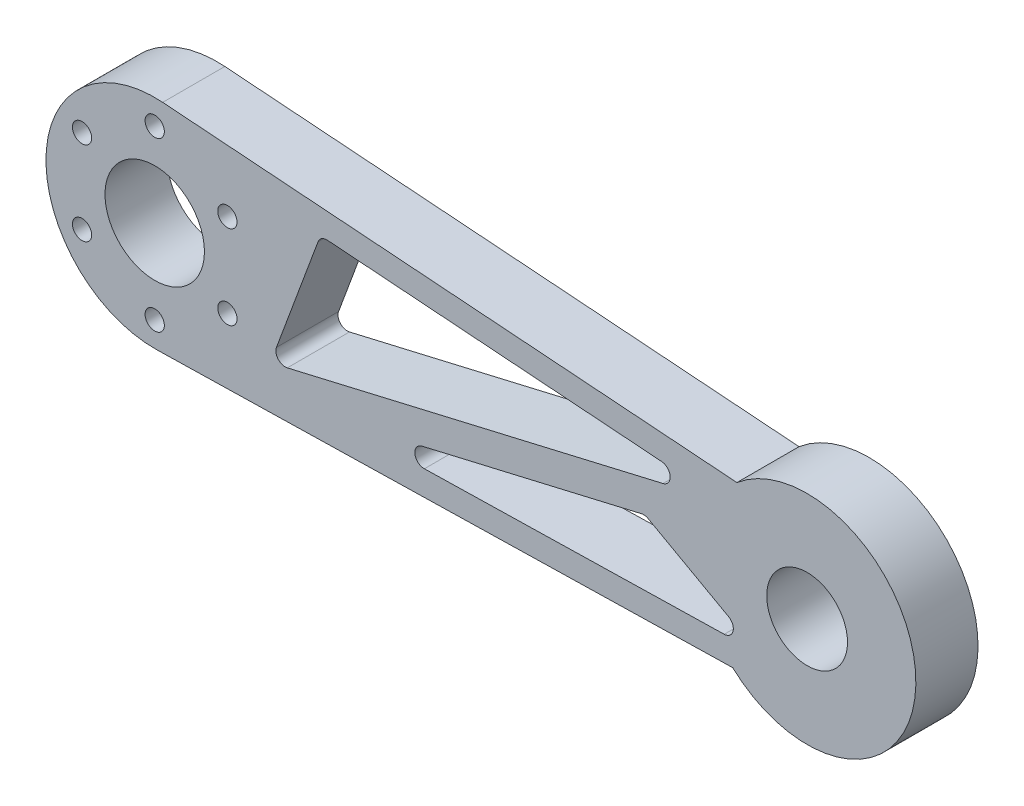
ISO-10303-21;
HEADER;
FILE_DESCRIPTION(('STEP AP214'),'2;1');
FILE_NAME('part.step','',(''),(''),'','','');
FILE_SCHEMA(('AUTOMOTIVE_DESIGN { 1 0 10303 214 1 1 1 1 }'));
ENDSEC;
DATA;
#1=APPLICATION_CONTEXT('core data for automotive mechanical design processes');
#2=APPLICATION_PROTOCOL_DEFINITION('international standard','automotive_design',2000,#1);
#3=PRODUCT_CONTEXT('',#1,'mechanical');
#4=PRODUCT('Part','Part','',(#3));
#5=PRODUCT_RELATED_PRODUCT_CATEGORY('part','',(#4));
#6=PRODUCT_DEFINITION_FORMATION('','',#4);
#7=PRODUCT_DEFINITION_CONTEXT('part definition',#1,'design');
#8=PRODUCT_DEFINITION('design','',#6,#7);
#9=PRODUCT_DEFINITION_SHAPE('','',#8);
#10=(LENGTH_UNIT() NAMED_UNIT(*) SI_UNIT(.MILLI.,.METRE.));
#11=(NAMED_UNIT(*) PLANE_ANGLE_UNIT() SI_UNIT($,.RADIAN.));
#12=(NAMED_UNIT(*) SI_UNIT($,.STERADIAN.) SOLID_ANGLE_UNIT());
#13=UNCERTAINTY_MEASURE_WITH_UNIT(LENGTH_MEASURE(1.E-05),#10,'distance_accuracy_value','');
#14=(GEOMETRIC_REPRESENTATION_CONTEXT(3) GLOBAL_UNCERTAINTY_ASSIGNED_CONTEXT((#13)) GLOBAL_UNIT_ASSIGNED_CONTEXT((#10,
#11,#12)) REPRESENTATION_CONTEXT('',''));
#15=CARTESIAN_POINT('',(0.,0.,0.));
#16=DIRECTION('',(0.,0.,1.));
#17=DIRECTION('',(1.,0.,0.));
#18=AXIS2_PLACEMENT_3D('',#15,#16,#17);
#19=CARTESIAN_POINT('',(0.384854301671509,-17.4957676929732,10.));
#20=DIRECTION('',(-0.0219916743812291,0.999758153884183,0.));
#21=DIRECTION('',(-0.999758153884183,-0.0219916743812291,0.));
#22=AXIS2_PLACEMENT_3D('',#19,#20,#21);
#23=PLANE('',#22);
#24=DIRECTION('',(0.999758153884183,0.0219916743812291,0.));
#25=VECTOR('',#24,1.);
#26=CARTESIAN_POINT('',(0.384854301671509,-17.4957676929732,0.));
#27=LINE('',#26,#25);
#28=CARTESIAN_POINT('',(0.38485430167151,-17.4957676929732,0.));
#29=VERTEX_POINT('',#28);
#30=CARTESIAN_POINT('',(92.9958873680545,-15.4586033293794,0.));
#31=VERTEX_POINT('',#30);
#32=EDGE_CURVE('E174',#29,#31,#27,.T.);
#33=ORIENTED_EDGE('',*,*,#32,.T.);
#34=DIRECTION('',(0.,0.,1.));
#35=VECTOR('',#34,1.);
#36=CARTESIAN_POINT('',(92.9958873680545,-15.4586033293795,-45.7543088802471));
#37=LINE('',#36,#35);
#38=CARTESIAN_POINT('',(92.9958873680545,-15.4586033293794,10.));
#39=VERTEX_POINT('',#38);
#40=EDGE_CURVE('E60',#31,#39,#37,.T.);
#41=ORIENTED_EDGE('',*,*,#40,.T.);
#42=DIRECTION('',(0.999758153884183,0.0219916743812291,0.));
#43=VECTOR('',#42,1.);
#44=CARTESIAN_POINT('',(0.384854301671509,-17.4957676929732,10.));
#45=LINE('',#44,#43);
#46=CARTESIAN_POINT('',(0.38485430167151,-17.4957676929732,10.));
#47=VERTEX_POINT('',#46);
#48=EDGE_CURVE('E168',#47,#39,#45,.T.);
#49=ORIENTED_EDGE('',*,*,#48,.F.);
#50=DIRECTION('',(0.,0.,-1.));
#51=VECTOR('',#50,1.);
#52=CARTESIAN_POINT('',(0.38485430167151,-17.4957676929732,10.));
#53=LINE('',#52,#51);
#54=EDGE_CURVE('E156',#47,#29,#53,.T.);
#55=ORIENTED_EDGE('',*,*,#54,.T.);
#56=EDGE_LOOP('',(#33,#41,#49,#55));
#57=FACE_BOUND('',#56,.T.);
#58=ADVANCED_FACE('F36',(#57),#23,.F.);
#59=CARTESIAN_POINT('',(1.28126439919047,17.4530330183429,10.));
#60=DIRECTION('',(0.0732151085251699,0.997316172476737,0.));
#61=DIRECTION('',(-0.997316172476737,0.0732151085251699,0.));
#62=AXIS2_PLACEMENT_3D('',#59,#60,#61);
#63=PLANE('',#62);
#64=DIRECTION('',(0.,0.,1.));
#65=VECTOR('',#64,1.);
#66=CARTESIAN_POINT('',(93.6660883369017,10.6708659409951,-45.7543088802471));
#67=LINE('',#66,#65);
#68=CARTESIAN_POINT('',(93.6660883369017,10.6708659409951,0.));
#69=VERTEX_POINT('',#68);
#70=CARTESIAN_POINT('',(93.6660883369017,10.6708659409951,10.));
#71=VERTEX_POINT('',#70);
#72=EDGE_CURVE('E656',#69,#71,#67,.T.);
#73=ORIENTED_EDGE('',*,*,#72,.F.);
#74=DIRECTION('',(0.997316172476737,-0.0732151085251699,0.));
#75=VECTOR('',#74,1.);
#76=CARTESIAN_POINT('',(1.28126439919047,17.4530330183429,0.));
#77=LINE('',#76,#75);
#78=CARTESIAN_POINT('',(1.28126439919047,17.4530330183429,0.));
#79=VERTEX_POINT('',#78);
#80=EDGE_CURVE('E152',#79,#69,#77,.T.);
#81=ORIENTED_EDGE('',*,*,#80,.F.);
#82=DIRECTION('',(0.,0.,-1.));
#83=VECTOR('',#82,1.);
#84=CARTESIAN_POINT('',(1.28126439919047,17.4530330183429,10.));
#85=LINE('',#84,#83);
#86=CARTESIAN_POINT('',(1.28126439919047,17.4530330183429,10.));
#87=VERTEX_POINT('',#86);
#88=EDGE_CURVE('E148',#87,#79,#85,.T.);
#89=ORIENTED_EDGE('',*,*,#88,.F.);
#90=DIRECTION('',(0.997316172476737,-0.0732151085251699,0.));
#91=VECTOR('',#90,1.);
#92=CARTESIAN_POINT('',(1.28126439919047,17.4530330183429,10.));
#93=LINE('',#92,#91);
#94=EDGE_CURVE('E52',#87,#71,#93,.T.);
#95=ORIENTED_EDGE('',*,*,#94,.T.);
#96=EDGE_LOOP('',(#73,#81,#89,#95));
#97=FACE_BOUND('',#96,.T.);
#98=ADVANCED_FACE('F150',(#97),#63,.T.);
#99=CARTESIAN_POINT('',(0.,0.,10.));
#100=DIRECTION('',(0.,0.,-1.));
#101=DIRECTION('',(-1.,0.,0.));
#102=AXIS2_PLACEMENT_3D('',#99,#100,#101);
#103=CYLINDRICAL_SURFACE('',#102,17.5);
#104=CARTESIAN_POINT('',(0.,0.,0.));
#105=DIRECTION('',(0.,0.,1.));
#106=DIRECTION('',(1.,0.,0.));
#107=AXIS2_PLACEMENT_3D('',#104,#105,#106);
#108=CIRCLE('',#107,17.5);
#109=EDGE_CURVE('E170',#79,#29,#108,.T.);
#110=ORIENTED_EDGE('',*,*,#109,.T.);
#111=ORIENTED_EDGE('',*,*,#54,.F.);
#112=CARTESIAN_POINT('',(0.,0.,10.));
#113=DIRECTION('',(0.,0.,1.));
#114=DIRECTION('',(1.,0.,0.));
#115=AXIS2_PLACEMENT_3D('',#112,#113,#114);
#116=CIRCLE('',#115,17.5);
#117=EDGE_CURVE('E159',#87,#47,#116,.T.);
#118=ORIENTED_EDGE('',*,*,#117,.F.);
#119=ORIENTED_EDGE('',*,*,#88,.T.);
#120=EDGE_LOOP('',(#110,#111,#118,#119));
#121=FACE_BOUND('',#120,.T.);
#122=ADVANCED_FACE('F160',(#121),#103,.T.);
#123=CARTESIAN_POINT('',(0.,0.,10.));
#124=DIRECTION('',(0.,0.,1.));
#125=DIRECTION('',(1.,0.,0.));
#126=AXIS2_PLACEMENT_3D('',#123,#124,#125);
#127=PLANE('',#126);
#128=CARTESIAN_POINT('',(104.965478154305,-2.69228450170992,10.));
#129=DIRECTION('',(0.,0.,1.));
#130=DIRECTION('',(1.,0.,0.));
#131=AXIS2_PLACEMENT_3D('',#128,#129,#130);
#132=CIRCLE('',#131,6.5);
#133=CARTESIAN_POINT('',(111.465478154305,-2.69228450170992,10.));
#134=VERTEX_POINT('',#133);
#135=EDGE_CURVE('E652',#134,#134,#132,.T.);
#136=ORIENTED_EDGE('',*,*,#135,.F.);
#137=EDGE_LOOP('',(#136));
#138=FACE_BOUND('',#137,.T.);
#139=DIRECTION('',(-0.997316172476736,0.0732151085251698,0.));
#140=VECTOR('',#139,1.);
#141=CARTESIAN_POINT('',(91.3622164155713,6.82923389592658,10.));
#142=LINE('',#141,#140);
#143=CARTESIAN_POINT('',(81.548754374642,7.54966108658364,10.));
#144=VERTEX_POINT('',#143);
#145=CARTESIAN_POINT('',(27.7920144663525,11.4960580818019,10.));
#146=VERTEX_POINT('',#145);
#147=EDGE_CURVE('E629',#144,#146,#142,.T.);
#148=ORIENTED_EDGE('',*,*,#147,.F.);
#149=CARTESIAN_POINT('',(81.4389317118542,6.05368682786854,10.));
#150=DIRECTION('',(0.,0.,1.));
#151=DIRECTION('',(1.,0.,0.));
#152=AXIS2_PLACEMENT_3D('',#149,#150,#151);
#153=CIRCLE('',#152,1.5);
#154=CARTESIAN_POINT('',(81.7798348519993,4.5929387150718,10.));
#155=VERTEX_POINT('',#154);
#156=EDGE_CURVE('E235',#144,#155,#153,.F.);
#157=ORIENTED_EDGE('',*,*,#156,.T.);
#158=DIRECTION('',(0.973832075197823,0.227268760096721,0.));
#159=VECTOR('',#158,1.);
#160=CARTESIAN_POINT('',(18.6174164282959,-10.1476360569692,10.));
#161=LINE('',#160,#159);
#162=CARTESIAN_POINT('',(21.334122649066,-9.51362279116457,10.));
#163=VERTEX_POINT('',#162);
#164=EDGE_CURVE('E262',#163,#155,#161,.T.);
#165=ORIENTED_EDGE('',*,*,#164,.F.);
#166=CARTESIAN_POINT('',(20.9932195089209,-8.05287467836783,10.));
#167=DIRECTION('',(0.,0.,1.));
#168=DIRECTION('',(1.,0.,0.));
#169=AXIS2_PLACEMENT_3D('',#166,#167,#168);
#170=CIRCLE('',#169,1.5);
#171=CARTESIAN_POINT('',(19.5866646751926,-7.5317187518781,10.));
#172=VERTEX_POINT('',#171);
#173=EDGE_CURVE('E227',#163,#172,#170,.F.);
#174=ORIENTED_EDGE('',*,*,#173,.T.);
#175=DIRECTION('',(-0.347437284326488,-0.937703222485577,0.));
#176=VECTOR('',#175,1.);
#177=CARTESIAN_POINT('',(26.6674159065165,11.5786172620077,10.));
#178=LINE('',#177,#176);
#179=CARTESIAN_POINT('',(26.2756369698363,10.5212397495765,10.));
#180=VERTEX_POINT('',#179);
#181=EDGE_CURVE('E633',#180,#172,#178,.T.);
#182=ORIENTED_EDGE('',*,*,#181,.F.);
#183=CARTESIAN_POINT('',(27.6821918035647,10.0000838230868,10.));
#184=DIRECTION('',(0.,0.,1.));
#185=DIRECTION('',(1.,0.,0.));
#186=AXIS2_PLACEMENT_3D('',#183,#184,#185);
#187=CIRCLE('',#186,1.5);
#188=EDGE_CURVE('E231',#180,#146,#187,.F.);
#189=ORIENTED_EDGE('',*,*,#188,.T.);
#190=EDGE_LOOP('',(#148,#157,#165,#174,#182,#189));
#191=FACE_BOUND('',#190,.T.);
#192=DIRECTION('',(-0.973832075197823,-0.227268760096721,0.));
#193=VECTOR('',#192,1.);
#194=CARTESIAN_POINT('',(78.8836122833561,-1.21732473408628,10.));
#195=LINE('',#194,#193);
#196=CARTESIAN_POINT('',(78.3203945009311,-1.34876608864441,10.));
#197=VERTEX_POINT('',#196);
#198=CARTESIAN_POINT('',(43.0137354546205,-9.58848300594014,10.));
#199=VERTEX_POINT('',#198);
#200=EDGE_CURVE('E252',#197,#199,#195,.T.);
#201=ORIENTED_EDGE('',*,*,#200,.F.);
#202=CARTESIAN_POINT('',(78.6612976410762,-2.80951420144114,10.));
#203=DIRECTION('',(0.,0.,1.));
#204=DIRECTION('',(1.,0.,0.));
#205=AXIS2_PLACEMENT_3D('',#202,#203,#204);
#206=CIRCLE('',#205,1.5);
#207=CARTESIAN_POINT('',(79.3892850664835,-1.49801341667248,10.));
#208=VERTEX_POINT('',#207);
#209=EDGE_CURVE('E239',#197,#208,#206,.F.);
#210=ORIENTED_EDGE('',*,*,#209,.T.);
#211=DIRECTION('',(-0.874333856512441,0.485324950271549,0.));
#212=VECTOR('',#211,1.);
#213=CARTESIAN_POINT('',(78.8836122833561,-1.21732473408628,10.));
#214=LINE('',#213,#212);
#215=CARTESIAN_POINT('',(92.3218414790464,-8.67661258798542,10.));
#216=VERTEX_POINT('',#215);
#217=EDGE_CURVE('E283',#216,#208,#214,.T.);
#218=ORIENTED_EDGE('',*,*,#217,.F.);
#219=CARTESIAN_POINT('',(91.593854053639,-9.98811337275408,10.));
#220=DIRECTION('',(0.,0.,1.));
#221=DIRECTION('',(1.,0.,0.));
#222=AXIS2_PLACEMENT_3D('',#219,#220,#221);
#223=CIRCLE('',#222,1.5);
#224=CARTESIAN_POINT('',(91.6268415652109,-11.4877506035804,10.));
#225=VERTEX_POINT('',#224);
#226=EDGE_CURVE('E243',#216,#225,#223,.F.);
#227=ORIENTED_EDGE('',*,*,#226,.T.);
#228=DIRECTION('',(0.999758153884183,0.0219916743812291,0.));
#229=VECTOR('',#228,1.);
#230=CARTESIAN_POINT('',(28.9697022761621,-12.8660193374243,10.));
#231=LINE('',#230,#229);
#232=CARTESIAN_POINT('',(43.3876261063374,-12.5488683495632,10.));
#233=VERTEX_POINT('',#232);
#234=EDGE_CURVE('E254',#233,#225,#231,.T.);
#235=ORIENTED_EDGE('',*,*,#234,.F.);
#236=CARTESIAN_POINT('',(43.3546385947656,-11.0492311187369,10.));
#237=DIRECTION('',(0.,0.,1.));
#238=DIRECTION('',(1.,0.,0.));
#239=AXIS2_PLACEMENT_3D('',#236,#237,#238);
#240=CIRCLE('',#239,1.5);
#241=EDGE_CURVE('E45',#233,#199,#240,.F.);
#242=ORIENTED_EDGE('',*,*,#241,.T.);
#243=EDGE_LOOP('',(#201,#210,#218,#227,#235,#242));
#244=FACE_BOUND('',#243,.T.);
#245=CARTESIAN_POINT('',(0.,13.5,10.));
#246=DIRECTION('',(0.,0.,1.));
#247=DIRECTION('',(1.,0.,0.));
#248=AXIS2_PLACEMENT_3D('',#245,#246,#247);
#249=CIRCLE('',#248,1.55);
#250=CARTESIAN_POINT('',(1.55,13.5,10.));
#251=VERTEX_POINT('',#250);
#252=EDGE_CURVE('E294',#251,#251,#249,.T.);
#253=ORIENTED_EDGE('',*,*,#252,.F.);
#254=EDGE_LOOP('',(#253));
#255=FACE_BOUND('',#254,.T.);
#256=CARTESIAN_POINT('',(1.14611941239482E-12,-13.5,10.));
#257=DIRECTION('',(0.,0.,1.));
#258=DIRECTION('',(1.,0.,0.));
#259=AXIS2_PLACEMENT_3D('',#256,#257,#258);
#260=CIRCLE('',#259,1.55000000000119);
#261=CARTESIAN_POINT('',(1.55000000000233,-13.5,10.));
#262=VERTEX_POINT('',#261);
#263=EDGE_CURVE('E308',#262,#262,#260,.T.);
#264=ORIENTED_EDGE('',*,*,#263,.F.);
#265=EDGE_LOOP('',(#264));
#266=FACE_BOUND('',#265,.T.);
#267=CARTESIAN_POINT('',(11.6913429510908,-6.7499999999995,10.));
#268=DIRECTION('',(0.,0.,1.));
#269=DIRECTION('',(1.,0.,0.));
#270=AXIS2_PLACEMENT_3D('',#267,#268,#269);
#271=CIRCLE('',#270,1.55000000000074);
#272=CARTESIAN_POINT('',(13.2413429510915,-6.7499999999995,10.));
#273=VERTEX_POINT('',#272);
#274=EDGE_CURVE('E302',#273,#273,#271,.T.);
#275=ORIENTED_EDGE('',*,*,#274,.F.);
#276=EDGE_LOOP('',(#275));
#277=FACE_BOUND('',#276,.T.);
#278=CARTESIAN_POINT('',(11.6913429510902,6.7500000000005,10.));
#279=DIRECTION('',(0.,0.,1.));
#280=DIRECTION('',(1.,0.,0.));
#281=AXIS2_PLACEMENT_3D('',#278,#279,#280);
#282=CIRCLE('',#281,1.55000000000016);
#283=CARTESIAN_POINT('',(13.2413429510904,6.7500000000005,10.));
#284=VERTEX_POINT('',#283);
#285=EDGE_CURVE('E301',#284,#284,#282,.T.);
#286=ORIENTED_EDGE('',*,*,#285,.F.);
#287=EDGE_LOOP('',(#286));
#288=FACE_BOUND('',#287,.T.);
#289=CARTESIAN_POINT('',(0.,0.,10.));
#290=DIRECTION('',(0.,0.,1.));
#291=DIRECTION('',(1.,0.,0.));
#292=AXIS2_PLACEMENT_3D('',#289,#290,#291);
#293=CIRCLE('',#292,8.);
#294=CARTESIAN_POINT('',(8.,0.,10.));
#295=VERTEX_POINT('',#294);
#296=EDGE_CURVE('E314',#295,#295,#293,.T.);
#297=ORIENTED_EDGE('',*,*,#296,.F.);
#298=EDGE_LOOP('',(#297));
#299=FACE_BOUND('',#298,.T.);
#300=CARTESIAN_POINT('',(-11.6913429510891,-6.7500000000005,10.));
#301=DIRECTION('',(0.,0.,1.));
#302=DIRECTION('',(1.,0.,0.));
#303=AXIS2_PLACEMENT_3D('',#300,#301,#302);
#304=CIRCLE('',#303,1.55000000000109);
#305=CARTESIAN_POINT('',(-10.141342951088,-6.7500000000005,10.));
#306=VERTEX_POINT('',#305);
#307=EDGE_CURVE('E324',#306,#306,#304,.T.);
#308=ORIENTED_EDGE('',*,*,#307,.F.);
#309=EDGE_LOOP('',(#308));
#310=FACE_BOUND('',#309,.T.);
#311=CARTESIAN_POINT('',(-11.6913429510896,6.7499999999995,10.));
#312=DIRECTION('',(0.,0.,1.));
#313=DIRECTION('',(1.,0.,0.));
#314=AXIS2_PLACEMENT_3D('',#311,#312,#313);
#315=CIRCLE('',#314,1.55000000000058);
#316=CARTESIAN_POINT('',(-10.1413429510891,6.7499999999995,10.));
#317=VERTEX_POINT('',#316);
#318=EDGE_CURVE('E286',#317,#317,#315,.T.);
#319=ORIENTED_EDGE('',*,*,#318,.F.);
#320=EDGE_LOOP('',(#319));
#321=FACE_BOUND('',#320,.T.);
#322=ORIENTED_EDGE('',*,*,#48,.T.);
#323=CARTESIAN_POINT('',(104.965478154305,-2.69228450170992,10.));
#324=DIRECTION('',(0.,0.,1.));
#325=DIRECTION('',(1.,0.,0.));
#326=AXIS2_PLACEMENT_3D('',#323,#324,#325);
#327=CIRCLE('',#326,17.5);
#328=EDGE_CURVE('E167',#39,#71,#327,.T.);
#329=ORIENTED_EDGE('',*,*,#328,.T.);
#330=ORIENTED_EDGE('',*,*,#94,.F.);
#331=ORIENTED_EDGE('',*,*,#117,.T.);
#332=EDGE_LOOP('',(#322,#329,#330,#331));
#333=FACE_BOUND('',#332,.T.);
#334=ADVANCED_FACE('F165',(#138,#191,#244,#255,#266,#277,#288,#299,#310,#321,#333),#127,.T.);
#335=CARTESIAN_POINT('',(0.,0.,0.));
#336=DIRECTION('',(0.,0.,1.));
#337=DIRECTION('',(1.,0.,0.));
#338=AXIS2_PLACEMENT_3D('',#335,#336,#337);
#339=PLANE('',#338);
#340=ORIENTED_EDGE('',*,*,#80,.T.);
#341=CARTESIAN_POINT('',(104.965478154305,-2.69228450170992,0.));
#342=DIRECTION('',(0.,0.,1.));
#343=DIRECTION('',(1.,0.,0.));
#344=AXIS2_PLACEMENT_3D('',#341,#342,#343);
#345=CIRCLE('',#344,17.5);
#346=EDGE_CURVE('E654',#69,#31,#345,.F.);
#347=ORIENTED_EDGE('',*,*,#346,.T.);
#348=ORIENTED_EDGE('',*,*,#32,.F.);
#349=ORIENTED_EDGE('',*,*,#109,.F.);
#350=EDGE_LOOP('',(#340,#347,#348,#349));
#351=FACE_BOUND('',#350,.T.);
#352=CARTESIAN_POINT('',(104.965478154305,-2.69228450170992,0.));
#353=DIRECTION('',(0.,0.,1.));
#354=DIRECTION('',(1.,0.,0.));
#355=AXIS2_PLACEMENT_3D('',#352,#353,#354);
#356=CIRCLE('',#355,6.5);
#357=CARTESIAN_POINT('',(111.465478154305,-2.69228450170992,0.));
#358=VERTEX_POINT('',#357);
#359=EDGE_CURVE('E40',#358,#358,#356,.T.);
#360=ORIENTED_EDGE('',*,*,#359,.T.);
#361=EDGE_LOOP('',(#360));
#362=FACE_BOUND('',#361,.T.);
#363=DIRECTION('',(-0.347437284326488,-0.937703222485577,0.));
#364=VECTOR('',#363,1.);
#365=CARTESIAN_POINT('',(19.6760878613258,-7.29037329592155,0.));
#366=LINE('',#365,#364);
#367=CARTESIAN_POINT('',(26.2756369698363,10.5212397495765,0.));
#368=VERTEX_POINT('',#367);
#369=CARTESIAN_POINT('',(19.5866646751926,-7.5317187518781,0.));
#370=VERTEX_POINT('',#369);
#371=EDGE_CURVE('E188',#368,#370,#366,.T.);
#372=ORIENTED_EDGE('',*,*,#371,.T.);
#373=CARTESIAN_POINT('',(20.9932195089209,-8.05287467836783,0.));
#374=DIRECTION('',(0.,0.,1.));
#375=DIRECTION('',(1.,0.,0.));
#376=AXIS2_PLACEMENT_3D('',#373,#374,#375);
#377=CIRCLE('',#376,1.5);
#378=CARTESIAN_POINT('',(21.334122649066,-9.51362279116457,0.));
#379=VERTEX_POINT('',#378);
#380=EDGE_CURVE('E229',#370,#379,#377,.T.);
#381=ORIENTED_EDGE('',*,*,#380,.T.);
#382=DIRECTION('',(0.973832075197823,0.227268760096721,0.));
#383=VECTOR('',#382,1.);
#384=CARTESIAN_POINT('',(3.20750097106295,-13.7439361464371,0.));
#385=LINE('',#384,#383);
#386=CARTESIAN_POINT('',(81.7798348519993,4.59293871507181,0.));
#387=VERTEX_POINT('',#386);
#388=EDGE_CURVE('E191',#379,#387,#385,.T.);
#389=ORIENTED_EDGE('',*,*,#388,.T.);
#390=CARTESIAN_POINT('',(81.4389317118542,6.05368682786854,0.));
#391=DIRECTION('',(0.,0.,1.));
#392=DIRECTION('',(1.,0.,0.));
#393=AXIS2_PLACEMENT_3D('',#390,#391,#392);
#394=CIRCLE('',#393,1.5);
#395=CARTESIAN_POINT('',(81.548754374642,7.54966108658364,0.));
#396=VERTEX_POINT('',#395);
#397=EDGE_CURVE('E237',#387,#396,#394,.T.);
#398=ORIENTED_EDGE('',*,*,#397,.T.);
#399=DIRECTION('',(-0.997316172476737,0.0732151085251698,0.));
#400=VECTOR('',#399,1.);
#401=CARTESIAN_POINT('',(0.988403965089791,13.4637683284359,0.));
#402=LINE('',#401,#400);
#403=CARTESIAN_POINT('',(27.7920144663525,11.4960580818019,0.));
#404=VERTEX_POINT('',#403);
#405=EDGE_CURVE('E194',#396,#404,#402,.T.);
#406=ORIENTED_EDGE('',*,*,#405,.T.);
#407=CARTESIAN_POINT('',(27.6821918035647,10.0000838230868,0.));
#408=DIRECTION('',(0.,0.,1.));
#409=DIRECTION('',(1.,0.,0.));
#410=AXIS2_PLACEMENT_3D('',#407,#408,#409);
#411=CIRCLE('',#410,1.5);
#412=EDGE_CURVE('E233',#404,#368,#411,.T.);
#413=ORIENTED_EDGE('',*,*,#412,.T.);
#414=EDGE_LOOP('',(#372,#381,#389,#398,#406,#413));
#415=FACE_BOUND('',#414,.T.);
#416=DIRECTION('',(0.999758153884183,0.0219916743812291,0.));
#417=VECTOR('',#416,1.);
#418=CARTESIAN_POINT('',(0.296887604146593,-13.4967350774365,0.));
#419=LINE('',#418,#417);
#420=CARTESIAN_POINT('',(43.3876261063374,-12.5488683495632,0.));
#421=VERTEX_POINT('',#420);
#422=CARTESIAN_POINT('',(91.6268415652109,-11.4877506035804,0.));
#423=VERTEX_POINT('',#422);
#424=EDGE_CURVE('E155',#421,#423,#419,.T.);
#425=ORIENTED_EDGE('',*,*,#424,.T.);
#426=CARTESIAN_POINT('',(91.593854053639,-9.98811337275408,0.));
#427=DIRECTION('',(0.,0.,1.));
#428=DIRECTION('',(1.,0.,0.));
#429=AXIS2_PLACEMENT_3D('',#426,#427,#428);
#430=CIRCLE('',#429,1.5);
#431=CARTESIAN_POINT('',(92.3218414790464,-8.67661258798543,0.));
#432=VERTEX_POINT('',#431);
#433=EDGE_CURVE('E245',#423,#432,#430,.T.);
#434=ORIENTED_EDGE('',*,*,#433,.T.);
#435=DIRECTION('',(-0.874333856512441,0.48532495027155,0.));
#436=VECTOR('',#435,1.);
#437=CARTESIAN_POINT('',(18.0637155310835,32.5425636048568,0.));
#438=LINE('',#437,#436);
#439=CARTESIAN_POINT('',(79.3892850664836,-1.49801341667249,0.));
#440=VERTEX_POINT('',#439);
#441=EDGE_CURVE('E182',#432,#440,#438,.T.);
#442=ORIENTED_EDGE('',*,*,#441,.T.);
#443=CARTESIAN_POINT('',(78.6612976410762,-2.80951420144114,0.));
#444=DIRECTION('',(0.,0.,1.));
#445=DIRECTION('',(1.,0.,0.));
#446=AXIS2_PLACEMENT_3D('',#443,#444,#445);
#447=CIRCLE('',#446,1.5);
#448=CARTESIAN_POINT('',(78.3203945009312,-1.34876608864441,0.));
#449=VERTEX_POINT('',#448);
#450=EDGE_CURVE('E241',#440,#449,#447,.T.);
#451=ORIENTED_EDGE('',*,*,#450,.T.);
#452=DIRECTION('',(-0.973832075197823,-0.227268760096721,0.));
#453=VECTOR('',#452,1.);
#454=CARTESIAN_POINT('',(4.34384477154656,-18.6130965224262,0.));
#455=LINE('',#454,#453);
#456=CARTESIAN_POINT('',(43.0137354546205,-9.58848300594014,0.));
#457=VERTEX_POINT('',#456);
#458=EDGE_CURVE('E185',#449,#457,#455,.T.);
#459=ORIENTED_EDGE('',*,*,#458,.T.);
#460=CARTESIAN_POINT('',(43.3546385947656,-11.0492311187369,0.));
#461=DIRECTION('',(0.,0.,1.));
#462=DIRECTION('',(1.,0.,0.));
#463=AXIS2_PLACEMENT_3D('',#460,#461,#462);
#464=CIRCLE('',#463,1.5);
#465=EDGE_CURVE('E11',#457,#421,#464,.T.);
#466=ORIENTED_EDGE('',*,*,#465,.T.);
#467=EDGE_LOOP('',(#425,#434,#442,#451,#459,#466));
#468=FACE_BOUND('',#467,.T.);
#469=CARTESIAN_POINT('',(0.,13.5,0.));
#470=DIRECTION('',(0.,0.,1.));
#471=DIRECTION('',(1.,0.,0.));
#472=AXIS2_PLACEMENT_3D('',#469,#470,#471);
#473=CIRCLE('',#472,1.55);
#474=CARTESIAN_POINT('',(1.55,13.5,0.));
#475=VERTEX_POINT('',#474);
#476=EDGE_CURVE('E176',#475,#475,#473,.T.);
#477=ORIENTED_EDGE('',*,*,#476,.T.);
#478=EDGE_LOOP('',(#477));
#479=FACE_BOUND('',#478,.T.);
#480=CARTESIAN_POINT('',(1.14611941239482E-12,-13.5,0.));
#481=DIRECTION('',(0.,0.,1.));
#482=DIRECTION('',(1.,0.,0.));
#483=AXIS2_PLACEMENT_3D('',#480,#481,#482);
#484=CIRCLE('',#483,1.55000000000119);
#485=CARTESIAN_POINT('',(1.55000000000233,-13.5,0.));
#486=VERTEX_POINT('',#485);
#487=EDGE_CURVE('E305',#486,#486,#484,.T.);
#488=ORIENTED_EDGE('',*,*,#487,.T.);
#489=EDGE_LOOP('',(#488));
#490=FACE_BOUND('',#489,.T.);
#491=CARTESIAN_POINT('',(11.6913429510908,-6.7499999999995,0.));
#492=DIRECTION('',(0.,0.,1.));
#493=DIRECTION('',(1.,0.,0.));
#494=AXIS2_PLACEMENT_3D('',#491,#492,#493);
#495=CIRCLE('',#494,1.55000000000074);
#496=CARTESIAN_POINT('',(13.2413429510915,-6.7499999999995,0.));
#497=VERTEX_POINT('',#496);
#498=EDGE_CURVE('E298',#497,#497,#495,.T.);
#499=ORIENTED_EDGE('',*,*,#498,.T.);
#500=EDGE_LOOP('',(#499));
#501=FACE_BOUND('',#500,.T.);
#502=CARTESIAN_POINT('',(11.6913429510902,6.7500000000005,0.));
#503=DIRECTION('',(0.,0.,1.));
#504=DIRECTION('',(1.,0.,0.));
#505=AXIS2_PLACEMENT_3D('',#502,#503,#504);
#506=CIRCLE('',#505,1.55000000000016);
#507=CARTESIAN_POINT('',(13.2413429510904,6.7500000000005,0.));
#508=VERTEX_POINT('',#507);
#509=EDGE_CURVE('E317',#508,#508,#506,.T.);
#510=ORIENTED_EDGE('',*,*,#509,.T.);
#511=EDGE_LOOP('',(#510));
#512=FACE_BOUND('',#511,.T.);
#513=CARTESIAN_POINT('',(0.,0.,0.));
#514=DIRECTION('',(0.,0.,1.));
#515=DIRECTION('',(1.,0.,0.));
#516=AXIS2_PLACEMENT_3D('',#513,#514,#515);
#517=CIRCLE('',#516,8.);
#518=CARTESIAN_POINT('',(8.,0.,0.));
#519=VERTEX_POINT('',#518);
#520=EDGE_CURVE('E297',#519,#519,#517,.T.);
#521=ORIENTED_EDGE('',*,*,#520,.T.);
#522=EDGE_LOOP('',(#521));
#523=FACE_BOUND('',#522,.T.);
#524=CARTESIAN_POINT('',(-11.6913429510891,-6.7500000000005,0.));
#525=DIRECTION('',(0.,0.,1.));
#526=DIRECTION('',(1.,0.,0.));
#527=AXIS2_PLACEMENT_3D('',#524,#525,#526);
#528=CIRCLE('',#527,1.55000000000109);
#529=CARTESIAN_POINT('',(-10.141342951088,-6.7500000000005,0.));
#530=VERTEX_POINT('',#529);
#531=EDGE_CURVE('E311',#530,#530,#528,.T.);
#532=ORIENTED_EDGE('',*,*,#531,.T.);
#533=EDGE_LOOP('',(#532));
#534=FACE_BOUND('',#533,.T.);
#535=CARTESIAN_POINT('',(-11.6913429510896,6.7499999999995,0.));
#536=DIRECTION('',(0.,0.,1.));
#537=DIRECTION('',(1.,0.,0.));
#538=AXIS2_PLACEMENT_3D('',#535,#536,#537);
#539=CIRCLE('',#538,1.55000000000058);
#540=CARTESIAN_POINT('',(-10.1413429510891,6.7499999999995,0.));
#541=VERTEX_POINT('',#540);
#542=EDGE_CURVE('E289',#541,#541,#539,.T.);
#543=ORIENTED_EDGE('',*,*,#542,.T.);
#544=EDGE_LOOP('',(#543));
#545=FACE_BOUND('',#544,.T.);
#546=ADVANCED_FACE('F267',(#351,#362,#415,#468,#479,#490,#501,#512,#523,#534,#545),#339,.F.);
#547=CARTESIAN_POINT('',(-11.6913429510896,6.7499999999995,0.));
#548=DIRECTION('',(0.,0.,1.));
#549=DIRECTION('',(1.,0.,0.));
#550=AXIS2_PLACEMENT_3D('',#547,#548,#549);
#551=CYLINDRICAL_SURFACE('',#550,1.55000000000058);
#552=ORIENTED_EDGE('',*,*,#542,.F.);
#553=EDGE_LOOP('',(#552));
#554=FACE_BOUND('',#553,.T.);
#555=ORIENTED_EDGE('',*,*,#318,.T.);
#556=EDGE_LOOP('',(#555));
#557=FACE_BOUND('',#556,.T.);
#558=ADVANCED_FACE('F331',(#554,#557),#551,.F.);
#559=CARTESIAN_POINT('',(-11.6913429510891,-6.7500000000005,0.));
#560=DIRECTION('',(0.,0.,1.));
#561=DIRECTION('',(1.,0.,0.));
#562=AXIS2_PLACEMENT_3D('',#559,#560,#561);
#563=CYLINDRICAL_SURFACE('',#562,1.55000000000109);
#564=ORIENTED_EDGE('',*,*,#531,.F.);
#565=EDGE_LOOP('',(#564));
#566=FACE_BOUND('',#565,.T.);
#567=ORIENTED_EDGE('',*,*,#307,.T.);
#568=EDGE_LOOP('',(#567));
#569=FACE_BOUND('',#568,.T.);
#570=ADVANCED_FACE('F334',(#566,#569),#563,.F.);
#571=CARTESIAN_POINT('',(0.,0.,0.));
#572=DIRECTION('',(0.,0.,1.));
#573=DIRECTION('',(1.,0.,0.));
#574=AXIS2_PLACEMENT_3D('',#571,#572,#573);
#575=CYLINDRICAL_SURFACE('',#574,8.);
#576=ORIENTED_EDGE('',*,*,#520,.F.);
#577=EDGE_LOOP('',(#576));
#578=FACE_BOUND('',#577,.T.);
#579=ORIENTED_EDGE('',*,*,#296,.T.);
#580=EDGE_LOOP('',(#579));
#581=FACE_BOUND('',#580,.T.);
#582=ADVANCED_FACE('F420',(#578,#581),#575,.F.);
#583=CARTESIAN_POINT('',(11.6913429510902,6.7500000000005,0.));
#584=DIRECTION('',(0.,0.,1.));
#585=DIRECTION('',(1.,0.,0.));
#586=AXIS2_PLACEMENT_3D('',#583,#584,#585);
#587=CYLINDRICAL_SURFACE('',#586,1.55000000000016);
#588=ORIENTED_EDGE('',*,*,#509,.F.);
#589=EDGE_LOOP('',(#588));
#590=FACE_BOUND('',#589,.T.);
#591=ORIENTED_EDGE('',*,*,#285,.T.);
#592=EDGE_LOOP('',(#591));
#593=FACE_BOUND('',#592,.T.);
#594=ADVANCED_FACE('F415',(#590,#593),#587,.F.);
#595=CARTESIAN_POINT('',(11.6913429510908,-6.7499999999995,0.));
#596=DIRECTION('',(0.,0.,1.));
#597=DIRECTION('',(1.,0.,0.));
#598=AXIS2_PLACEMENT_3D('',#595,#596,#597);
#599=CYLINDRICAL_SURFACE('',#598,1.55000000000074);
#600=ORIENTED_EDGE('',*,*,#498,.F.);
#601=EDGE_LOOP('',(#600));
#602=FACE_BOUND('',#601,.T.);
#603=ORIENTED_EDGE('',*,*,#274,.T.);
#604=EDGE_LOOP('',(#603));
#605=FACE_BOUND('',#604,.T.);
#606=ADVANCED_FACE('F412',(#602,#605),#599,.F.);
#607=CARTESIAN_POINT('',(1.14611941239482E-12,-13.5,0.));
#608=DIRECTION('',(0.,0.,1.));
#609=DIRECTION('',(1.,0.,0.));
#610=AXIS2_PLACEMENT_3D('',#607,#608,#609);
#611=CYLINDRICAL_SURFACE('',#610,1.55000000000119);
#612=ORIENTED_EDGE('',*,*,#487,.F.);
#613=EDGE_LOOP('',(#612));
#614=FACE_BOUND('',#613,.T.);
#615=ORIENTED_EDGE('',*,*,#263,.T.);
#616=EDGE_LOOP('',(#615));
#617=FACE_BOUND('',#616,.T.);
#618=ADVANCED_FACE('F410',(#614,#617),#611,.F.);
#619=CARTESIAN_POINT('',(0.,13.5,0.));
#620=DIRECTION('',(0.,0.,1.));
#621=DIRECTION('',(1.,0.,0.));
#622=AXIS2_PLACEMENT_3D('',#619,#620,#621);
#623=CYLINDRICAL_SURFACE('',#622,1.55);
#624=ORIENTED_EDGE('',*,*,#476,.F.);
#625=EDGE_LOOP('',(#624));
#626=FACE_BOUND('',#625,.T.);
#627=ORIENTED_EDGE('',*,*,#252,.T.);
#628=EDGE_LOOP('',(#627));
#629=FACE_BOUND('',#628,.T.);
#630=ADVANCED_FACE('F407',(#626,#629),#623,.F.);
#631=CARTESIAN_POINT('',(78.8836122833561,-1.21732473408628,-15.));
#632=DIRECTION('',(-0.227268760096721,0.973832075197823,0.));
#633=DIRECTION('',(-0.973832075197823,-0.227268760096721,0.));
#634=AXIS2_PLACEMENT_3D('',#631,#632,#633);
#635=PLANE('',#634);
#636=ORIENTED_EDGE('',*,*,#458,.F.);
#637=DIRECTION('',(0.,0.,1.));
#638=VECTOR('',#637,1.);
#639=CARTESIAN_POINT('',(78.3203945009311,-1.34876608864441,10.));
#640=LINE('',#639,#638);
#641=EDGE_CURVE('E214',#449,#197,#640,.T.);
#642=ORIENTED_EDGE('',*,*,#641,.T.);
#643=ORIENTED_EDGE('',*,*,#200,.T.);
#644=DIRECTION('',(0.,0.,1.));
#645=VECTOR('',#644,1.);
#646=CARTESIAN_POINT('',(43.0137354546205,-9.58848300594014,0.));
#647=LINE('',#646,#645);
#648=EDGE_CURVE('E212',#199,#457,#647,.F.);
#649=ORIENTED_EDGE('',*,*,#648,.T.);
#650=EDGE_LOOP('',(#636,#642,#643,#649));
#651=FACE_BOUND('',#650,.T.);
#652=ADVANCED_FACE('F260',(#651),#635,.F.);
#653=CARTESIAN_POINT('',(78.8836122833561,-1.21732473408628,-15.));
#654=DIRECTION('',(0.485324950271549,0.874333856512441,0.));
#655=DIRECTION('',(-0.874333856512441,0.48532495027155,0.));
#656=AXIS2_PLACEMENT_3D('',#653,#654,#655);
#657=PLANE('',#656);
#658=ORIENTED_EDGE('',*,*,#217,.T.);
#659=DIRECTION('',(0.,0.,1.));
#660=VECTOR('',#659,1.);
#661=CARTESIAN_POINT('',(79.3892850664835,-1.49801341667248,0.));
#662=LINE('',#661,#660);
#663=EDGE_CURVE('E220',#208,#440,#662,.F.);
#664=ORIENTED_EDGE('',*,*,#663,.T.);
#665=ORIENTED_EDGE('',*,*,#441,.F.);
#666=DIRECTION('',(0.,0.,1.));
#667=VECTOR('',#666,1.);
#668=CARTESIAN_POINT('',(92.3218414790464,-8.67661258798542,10.));
#669=LINE('',#668,#667);
#670=EDGE_CURVE('E217',#432,#216,#669,.T.);
#671=ORIENTED_EDGE('',*,*,#670,.T.);
#672=EDGE_LOOP('',(#658,#664,#665,#671));
#673=FACE_BOUND('',#672,.T.);
#674=ADVANCED_FACE('F280',(#673),#657,.F.);
#675=CARTESIAN_POINT('',(28.9697022761621,-12.8660193374243,-15.));
#676=DIRECTION('',(0.0219916743812291,-0.999758153884183,0.));
#677=DIRECTION('',(0.999758153884183,0.0219916743812291,0.));
#678=AXIS2_PLACEMENT_3D('',#675,#676,#677);
#679=PLANE('',#678);
#680=ORIENTED_EDGE('',*,*,#234,.T.);
#681=DIRECTION('',(0.,0.,1.));
#682=VECTOR('',#681,1.);
#683=CARTESIAN_POINT('',(91.6268415652109,-11.4877506035804,0.));
#684=LINE('',#683,#682);
#685=EDGE_CURVE('E225',#225,#423,#684,.F.);
#686=ORIENTED_EDGE('',*,*,#685,.T.);
#687=ORIENTED_EDGE('',*,*,#424,.F.);
#688=DIRECTION('',(0.,0.,1.));
#689=VECTOR('',#688,1.);
#690=CARTESIAN_POINT('',(43.3876261063374,-12.5488683495632,10.));
#691=LINE('',#690,#689);
#692=EDGE_CURVE('E222',#421,#233,#691,.T.);
#693=ORIENTED_EDGE('',*,*,#692,.T.);
#694=EDGE_LOOP('',(#680,#686,#687,#693));
#695=FACE_BOUND('',#694,.T.);
#696=ADVANCED_FACE('F271',(#695),#679,.F.);
#697=CARTESIAN_POINT('',(91.3622164155713,6.82923389592658,-15.));
#698=DIRECTION('',(0.0732151085251698,0.997316172476736,0.));
#699=DIRECTION('',(-0.997316172476737,0.0732151085251698,0.));
#700=AXIS2_PLACEMENT_3D('',#697,#698,#699);
#701=PLANE('',#700);
#702=ORIENTED_EDGE('',*,*,#147,.T.);
#703=DIRECTION('',(0.,0.,1.));
#704=VECTOR('',#703,1.);
#705=CARTESIAN_POINT('',(27.7920144663524,11.4960580818019,0.));
#706=LINE('',#705,#704);
#707=EDGE_CURVE('E210',#146,#404,#706,.F.);
#708=ORIENTED_EDGE('',*,*,#707,.T.);
#709=ORIENTED_EDGE('',*,*,#405,.F.);
#710=DIRECTION('',(0.,0.,1.));
#711=VECTOR('',#710,1.);
#712=CARTESIAN_POINT('',(81.548754374642,7.54966108658364,10.));
#713=LINE('',#712,#711);
#714=EDGE_CURVE('E207',#396,#144,#713,.T.);
#715=ORIENTED_EDGE('',*,*,#714,.T.);
#716=EDGE_LOOP('',(#702,#708,#709,#715));
#717=FACE_BOUND('',#716,.T.);
#718=ADVANCED_FACE('F393',(#717),#701,.F.);
#719=CARTESIAN_POINT('',(18.6174164282959,-10.1476360569692,-15.));
#720=DIRECTION('',(0.227268760096721,-0.973832075197823,0.));
#721=DIRECTION('',(0.973832075197823,0.227268760096721,0.));
#722=AXIS2_PLACEMENT_3D('',#719,#720,#721);
#723=PLANE('',#722);
#724=ORIENTED_EDGE('',*,*,#388,.F.);
#725=DIRECTION('',(0.,0.,1.));
#726=VECTOR('',#725,1.);
#727=CARTESIAN_POINT('',(21.334122649066,-9.51362279116457,9.99999999999999));
#728=LINE('',#727,#726);
#729=EDGE_CURVE('E199',#379,#163,#728,.T.);
#730=ORIENTED_EDGE('',*,*,#729,.T.);
#731=ORIENTED_EDGE('',*,*,#164,.T.);
#732=DIRECTION('',(0.,0.,1.));
#733=VECTOR('',#732,1.);
#734=CARTESIAN_POINT('',(81.7798348519993,4.59293871507181,0.));
#735=LINE('',#734,#733);
#736=EDGE_CURVE('E197',#155,#387,#735,.F.);
#737=ORIENTED_EDGE('',*,*,#736,.T.);
#738=EDGE_LOOP('',(#724,#730,#731,#737));
#739=FACE_BOUND('',#738,.T.);
#740=ADVANCED_FACE('F390',(#739),#723,.F.);
#741=CARTESIAN_POINT('',(26.6674159065165,11.5786172620077,-15.));
#742=DIRECTION('',(-0.937703222485577,0.347437284326488,0.));
#743=DIRECTION('',(-0.347437284326488,-0.937703222485577,0.));
#744=AXIS2_PLACEMENT_3D('',#741,#742,#743);
#745=PLANE('',#744);
#746=ORIENTED_EDGE('',*,*,#181,.T.);
#747=DIRECTION('',(0.,0.,1.));
#748=VECTOR('',#747,1.);
#749=CARTESIAN_POINT('',(19.5866646751926,-7.5317187518781,0.));
#750=LINE('',#749,#748);
#751=EDGE_CURVE('E205',#172,#370,#750,.F.);
#752=ORIENTED_EDGE('',*,*,#751,.T.);
#753=ORIENTED_EDGE('',*,*,#371,.F.);
#754=DIRECTION('',(0.,0.,1.));
#755=VECTOR('',#754,1.);
#756=CARTESIAN_POINT('',(26.2756369698363,10.5212397495765,9.99999999999999));
#757=LINE('',#756,#755);
#758=EDGE_CURVE('E202',#368,#180,#757,.T.);
#759=ORIENTED_EDGE('',*,*,#758,.T.);
#760=EDGE_LOOP('',(#746,#752,#753,#759));
#761=FACE_BOUND('',#760,.T.);
#762=ADVANCED_FACE('F361',(#761),#745,.F.);
#763=CARTESIAN_POINT('',(20.9932195089209,-8.05287467836783,-15.));
#764=DIRECTION('',(0.,0.,-1.));
#765=DIRECTION('',(-1.,0.,0.));
#766=AXIS2_PLACEMENT_3D('',#763,#764,#765);
#767=CYLINDRICAL_SURFACE('',#766,1.5);
#768=ORIENTED_EDGE('',*,*,#380,.F.);
#769=ORIENTED_EDGE('',*,*,#751,.F.);
#770=ORIENTED_EDGE('',*,*,#173,.F.);
#771=ORIENTED_EDGE('',*,*,#729,.F.);
#772=EDGE_LOOP('',(#768,#769,#770,#771));
#773=FACE_BOUND('',#772,.T.);
#774=ADVANCED_FACE('F357',(#773),#767,.F.);
#775=CARTESIAN_POINT('',(27.6821918035647,10.0000838230868,-15.));
#776=DIRECTION('',(0.,0.,-1.));
#777=DIRECTION('',(-1.,0.,0.));
#778=AXIS2_PLACEMENT_3D('',#775,#776,#777);
#779=CYLINDRICAL_SURFACE('',#778,1.5);
#780=ORIENTED_EDGE('',*,*,#412,.F.);
#781=ORIENTED_EDGE('',*,*,#707,.F.);
#782=ORIENTED_EDGE('',*,*,#188,.F.);
#783=ORIENTED_EDGE('',*,*,#758,.F.);
#784=EDGE_LOOP('',(#780,#781,#782,#783));
#785=FACE_BOUND('',#784,.T.);
#786=ADVANCED_FACE('F360',(#785),#779,.F.);
#787=CARTESIAN_POINT('',(81.4389317118542,6.05368682786854,-15.));
#788=DIRECTION('',(0.,0.,-1.));
#789=DIRECTION('',(-1.,0.,0.));
#790=AXIS2_PLACEMENT_3D('',#787,#788,#789);
#791=CYLINDRICAL_SURFACE('',#790,1.5);
#792=ORIENTED_EDGE('',*,*,#397,.F.);
#793=ORIENTED_EDGE('',*,*,#736,.F.);
#794=ORIENTED_EDGE('',*,*,#156,.F.);
#795=ORIENTED_EDGE('',*,*,#714,.F.);
#796=EDGE_LOOP('',(#792,#793,#794,#795));
#797=FACE_BOUND('',#796,.T.);
#798=ADVANCED_FACE('F365',(#797),#791,.F.);
#799=CARTESIAN_POINT('',(78.6612976410762,-2.80951420144114,-15.));
#800=DIRECTION('',(0.,0.,-1.));
#801=DIRECTION('',(-1.,0.,0.));
#802=AXIS2_PLACEMENT_3D('',#799,#800,#801);
#803=CYLINDRICAL_SURFACE('',#802,1.5);
#804=ORIENTED_EDGE('',*,*,#450,.F.);
#805=ORIENTED_EDGE('',*,*,#663,.F.);
#806=ORIENTED_EDGE('',*,*,#209,.F.);
#807=ORIENTED_EDGE('',*,*,#641,.F.);
#808=EDGE_LOOP('',(#804,#805,#806,#807));
#809=FACE_BOUND('',#808,.T.);
#810=ADVANCED_FACE('F285',(#809),#803,.F.);
#811=CARTESIAN_POINT('',(91.593854053639,-9.98811337275408,-15.));
#812=DIRECTION('',(0.,0.,-1.));
#813=DIRECTION('',(-1.,0.,0.));
#814=AXIS2_PLACEMENT_3D('',#811,#812,#813);
#815=CYLINDRICAL_SURFACE('',#814,1.5);
#816=ORIENTED_EDGE('',*,*,#433,.F.);
#817=ORIENTED_EDGE('',*,*,#685,.F.);
#818=ORIENTED_EDGE('',*,*,#226,.F.);
#819=ORIENTED_EDGE('',*,*,#670,.F.);
#820=EDGE_LOOP('',(#816,#817,#818,#819));
#821=FACE_BOUND('',#820,.T.);
#822=ADVANCED_FACE('F274',(#821),#815,.F.);
#823=CARTESIAN_POINT('',(43.3546385947656,-11.0492311187369,-15.));
#824=DIRECTION('',(0.,0.,-1.));
#825=DIRECTION('',(-1.,0.,0.));
#826=AXIS2_PLACEMENT_3D('',#823,#824,#825);
#827=CYLINDRICAL_SURFACE('',#826,1.5);
#828=ORIENTED_EDGE('',*,*,#465,.F.);
#829=ORIENTED_EDGE('',*,*,#648,.F.);
#830=ORIENTED_EDGE('',*,*,#241,.F.);
#831=ORIENTED_EDGE('',*,*,#692,.F.);
#832=EDGE_LOOP('',(#828,#829,#830,#831));
#833=FACE_BOUND('',#832,.T.);
#834=ADVANCED_FACE('F38',(#833),#827,.F.);
#835=CARTESIAN_POINT('',(104.965478154305,-2.69228450170992,-15.));
#836=DIRECTION('',(0.,0.,1.));
#837=DIRECTION('',(1.,0.,0.));
#838=AXIS2_PLACEMENT_3D('',#835,#836,#837);
#839=CYLINDRICAL_SURFACE('',#838,6.5);
#840=ORIENTED_EDGE('',*,*,#135,.T.);
#841=EDGE_LOOP('',(#840));
#842=FACE_BOUND('',#841,.T.);
#843=ORIENTED_EDGE('',*,*,#359,.F.);
#844=EDGE_LOOP('',(#843));
#845=FACE_BOUND('',#844,.T.);
#846=ADVANCED_FACE('F375',(#842,#845),#839,.F.);
#847=CARTESIAN_POINT('',(104.965478154305,-2.69228450170992,-45.7543088802471));
#848=DIRECTION('',(0.,0.,1.));
#849=DIRECTION('',(1.,0.,0.));
#850=AXIS2_PLACEMENT_3D('',#847,#848,#849);
#851=CYLINDRICAL_SURFACE('',#850,17.5);
#852=ORIENTED_EDGE('',*,*,#346,.F.);
#853=ORIENTED_EDGE('',*,*,#72,.T.);
#854=ORIENTED_EDGE('',*,*,#328,.F.);
#855=ORIENTED_EDGE('',*,*,#40,.F.);
#856=EDGE_LOOP('',(#852,#853,#854,#855));
#857=FACE_BOUND('',#856,.T.);
#858=ADVANCED_FACE('F379',(#857),#851,.T.);
#859=CLOSED_SHELL('',(#58,#98,#122,#334,#546,#558,#570,#582,#594,#606,#618,#630,#652,#674,#696,
#718,#740,#762,#774,#786,#798,#810,#822,#834,#846,#858));
#860=MANIFOLD_SOLID_BREP('B2',#859);
#861=ADVANCED_BREP_SHAPE_REPRESENTATION('',(#18,#860),#14);
#862=SHAPE_DEFINITION_REPRESENTATION(#9,#861);
ENDSEC;
END-ISO-10303-21;
